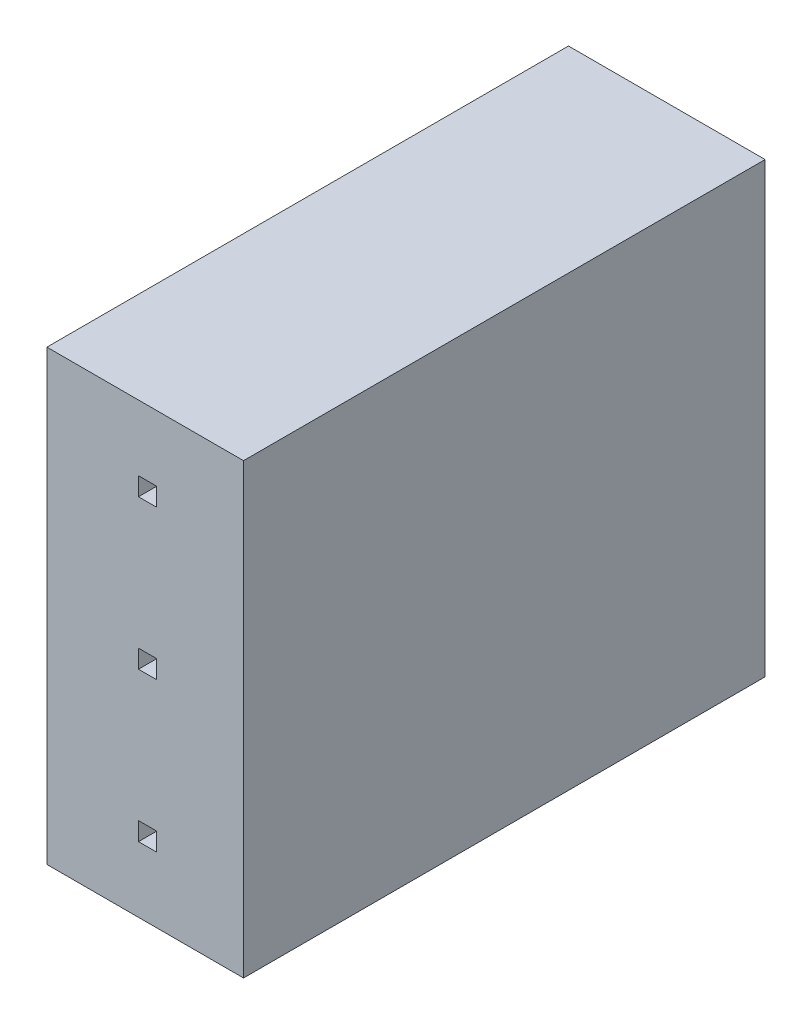
ISO-10303-21;
HEADER;
FILE_DESCRIPTION(('STEP AP214'),'2;1');
FILE_NAME('part.step','',(''),(''),'','','');
FILE_SCHEMA(('AUTOMOTIVE_DESIGN { 1 0 10303 214 1 1 1 1 }'));
ENDSEC;
DATA;
#1=APPLICATION_CONTEXT('core data for automotive mechanical design processes');
#2=APPLICATION_PROTOCOL_DEFINITION('international standard','automotive_design',2000,#1);
#3=PRODUCT_CONTEXT('',#1,'mechanical');
#4=PRODUCT('Part','Part','',(#3));
#5=PRODUCT_RELATED_PRODUCT_CATEGORY('part','',(#4));
#6=PRODUCT_DEFINITION_FORMATION('','',#4);
#7=PRODUCT_DEFINITION_CONTEXT('part definition',#1,'design');
#8=PRODUCT_DEFINITION('design','',#6,#7);
#9=PRODUCT_DEFINITION_SHAPE('','',#8);
#10=(LENGTH_UNIT() NAMED_UNIT(*) SI_UNIT(.MILLI.,.METRE.));
#11=(NAMED_UNIT(*) PLANE_ANGLE_UNIT() SI_UNIT($,.RADIAN.));
#12=(NAMED_UNIT(*) SI_UNIT($,.STERADIAN.) SOLID_ANGLE_UNIT());
#13=UNCERTAINTY_MEASURE_WITH_UNIT(LENGTH_MEASURE(1.E-05),#10,'distance_accuracy_value','');
#14=(GEOMETRIC_REPRESENTATION_CONTEXT(3) GLOBAL_UNCERTAINTY_ASSIGNED_CONTEXT((#13)) GLOBAL_UNIT_ASSIGNED_CONTEXT((#10,
#11,#12)) REPRESENTATION_CONTEXT('',''));
#15=CARTESIAN_POINT('',(0.,0.,0.));
#16=DIRECTION('',(0.,0.,1.));
#17=DIRECTION('',(1.,0.,0.));
#18=AXIS2_PLACEMENT_3D('',#15,#16,#17);
#19=CARTESIAN_POINT('',(0.,0.,10.));
#20=DIRECTION('',(0.,0.,1.));
#21=DIRECTION('',(1.,0.,0.));
#22=AXIS2_PLACEMENT_3D('',#19,#20,#21);
#23=PLANE('',#22);
#24=DIRECTION('',(-1.,0.,0.));
#25=VECTOR('',#24,1.);
#26=CARTESIAN_POINT('',(1.8390508777679,4.295,10.));
#27=LINE('',#26,#25);
#28=CARTESIAN_POINT('',(1.8390508777679,4.295,10.));
#29=VERTEX_POINT('',#28);
#30=CARTESIAN_POINT('',(-1.9309491222321,4.295,10.));
#31=VERTEX_POINT('',#30);
#32=EDGE_CURVE('E359',#29,#31,#27,.T.);
#33=ORIENTED_EDGE('',*,*,#32,.T.);
#34=DIRECTION('',(0.,-1.,0.));
#35=VECTOR('',#34,1.);
#36=CARTESIAN_POINT('',(-1.9309491222321,4.295,10.));
#37=LINE('',#36,#35);
#38=CARTESIAN_POINT('',(-1.9309491222321,-4.295,10.));
#39=VERTEX_POINT('',#38);
#40=EDGE_CURVE('E363',#31,#39,#37,.T.);
#41=ORIENTED_EDGE('',*,*,#40,.T.);
#42=DIRECTION('',(1.,0.,0.));
#43=VECTOR('',#42,1.);
#44=CARTESIAN_POINT('',(-1.9309491222321,-4.295,10.));
#45=LINE('',#44,#43);
#46=CARTESIAN_POINT('',(1.8390508777679,-4.295,10.));
#47=VERTEX_POINT('',#46);
#48=EDGE_CURVE('E367',#39,#47,#45,.T.);
#49=ORIENTED_EDGE('',*,*,#48,.T.);
#50=DIRECTION('',(0.,1.,0.));
#51=VECTOR('',#50,1.);
#52=CARTESIAN_POINT('',(1.8390508777679,-4.295,10.));
#53=LINE('',#52,#51);
#54=EDGE_CURVE('E370',#47,#29,#53,.T.);
#55=ORIENTED_EDGE('',*,*,#54,.T.);
#56=EDGE_LOOP('',(#33,#41,#49,#55));
#57=FACE_BOUND('',#56,.T.);
#58=DIRECTION('',(0.,1.,0.));
#59=VECTOR('',#58,1.);
#60=CARTESIAN_POINT('',(0.175,0.,10.));
#61=LINE('',#60,#59);
#62=CARTESIAN_POINT('',(0.175,2.6883,10.));
#63=VERTEX_POINT('',#62);
#64=CARTESIAN_POINT('',(0.175,3.0383,10.));
#65=VERTEX_POINT('',#64);
#66=EDGE_CURVE('E319',#63,#65,#61,.T.);
#67=ORIENTED_EDGE('',*,*,#66,.F.);
#68=DIRECTION('',(1.,0.,0.));
#69=VECTOR('',#68,1.);
#70=CARTESIAN_POINT('',(0.,2.6883,10.));
#71=LINE('',#70,#69);
#72=CARTESIAN_POINT('',(-0.175,2.6883,10.));
#73=VERTEX_POINT('',#72);
#74=EDGE_CURVE('E316',#73,#63,#71,.T.);
#75=ORIENTED_EDGE('',*,*,#74,.F.);
#76=DIRECTION('',(0.,-1.,0.));
#77=VECTOR('',#76,1.);
#78=CARTESIAN_POINT('',(-0.175,0.,10.));
#79=LINE('',#78,#77);
#80=CARTESIAN_POINT('',(-0.175,3.0383,10.));
#81=VERTEX_POINT('',#80);
#82=EDGE_CURVE('E327',#81,#73,#79,.T.);
#83=ORIENTED_EDGE('',*,*,#82,.F.);
#84=DIRECTION('',(-1.,0.,0.));
#85=VECTOR('',#84,1.);
#86=CARTESIAN_POINT('',(0.,3.0383,10.));
#87=LINE('',#86,#85);
#88=EDGE_CURVE('E323',#65,#81,#87,.T.);
#89=ORIENTED_EDGE('',*,*,#88,.F.);
#90=EDGE_LOOP('',(#67,#75,#83,#89));
#91=FACE_BOUND('',#90,.T.);
#92=DIRECTION('',(0.,-1.,0.));
#93=VECTOR('',#92,1.);
#94=CARTESIAN_POINT('',(-0.175,0.,10.));
#95=LINE('',#94,#93);
#96=CARTESIAN_POINT('',(-0.175,0.175,10.));
#97=VERTEX_POINT('',#96);
#98=CARTESIAN_POINT('',(-0.175,-0.175,10.));
#99=VERTEX_POINT('',#98);
#100=EDGE_CURVE('E276',#97,#99,#95,.T.);
#101=ORIENTED_EDGE('',*,*,#100,.F.);
#102=DIRECTION('',(-1.,0.,0.));
#103=VECTOR('',#102,1.);
#104=CARTESIAN_POINT('',(0.,0.175,10.));
#105=LINE('',#104,#103);
#106=CARTESIAN_POINT('',(0.175,0.175,10.));
#107=VERTEX_POINT('',#106);
#108=EDGE_CURVE('E273',#107,#97,#105,.T.);
#109=ORIENTED_EDGE('',*,*,#108,.F.);
#110=DIRECTION('',(0.,1.,0.));
#111=VECTOR('',#110,1.);
#112=CARTESIAN_POINT('',(0.175,0.,10.));
#113=LINE('',#112,#111);
#114=CARTESIAN_POINT('',(0.175,-0.175,10.));
#115=VERTEX_POINT('',#114);
#116=EDGE_CURVE('E284',#115,#107,#113,.T.);
#117=ORIENTED_EDGE('',*,*,#116,.F.);
#118=DIRECTION('',(1.,0.,0.));
#119=VECTOR('',#118,1.);
#120=CARTESIAN_POINT('',(0.,-0.175,10.));
#121=LINE('',#120,#119);
#122=EDGE_CURVE('E280',#99,#115,#121,.T.);
#123=ORIENTED_EDGE('',*,*,#122,.F.);
#124=EDGE_LOOP('',(#101,#109,#117,#123));
#125=FACE_BOUND('',#124,.T.);
#126=DIRECTION('',(0.,1.,0.));
#127=VECTOR('',#126,1.);
#128=CARTESIAN_POINT('',(0.175,-3.0383,10.));
#129=LINE('',#128,#127);
#130=CARTESIAN_POINT('',(0.175,-3.0383,10.));
#131=VERTEX_POINT('',#130);
#132=CARTESIAN_POINT('',(0.175,-2.6883,10.));
#133=VERTEX_POINT('',#132);
#134=EDGE_CURVE('E234',#131,#133,#129,.T.);
#135=ORIENTED_EDGE('',*,*,#134,.F.);
#136=DIRECTION('',(1.,0.,0.));
#137=VECTOR('',#136,1.);
#138=CARTESIAN_POINT('',(-0.175,-3.0383,10.));
#139=LINE('',#138,#137);
#140=CARTESIAN_POINT('',(-0.175,-3.0383,10.));
#141=VERTEX_POINT('',#140);
#142=EDGE_CURVE('E225',#141,#131,#139,.T.);
#143=ORIENTED_EDGE('',*,*,#142,.F.);
#144=DIRECTION('',(0.,-1.,0.));
#145=VECTOR('',#144,1.);
#146=CARTESIAN_POINT('',(-0.175,-2.6883,10.));
#147=LINE('',#146,#145);
#148=CARTESIAN_POINT('',(-0.175,-2.6883,10.));
#149=VERTEX_POINT('',#148);
#150=EDGE_CURVE('E251',#149,#141,#147,.T.);
#151=ORIENTED_EDGE('',*,*,#150,.F.);
#152=DIRECTION('',(-1.,0.,0.));
#153=VECTOR('',#152,1.);
#154=CARTESIAN_POINT('',(0.175,-2.6883,10.));
#155=LINE('',#154,#153);
#156=EDGE_CURVE('E247',#133,#149,#155,.T.);
#157=ORIENTED_EDGE('',*,*,#156,.F.);
#158=EDGE_LOOP('',(#135,#143,#151,#157));
#159=FACE_BOUND('',#158,.T.);
#160=ADVANCED_FACE('F111',(#57,#91,#125,#159),#23,.T.);
#161=CARTESIAN_POINT('',(0.,0.,0.));
#162=DIRECTION('',(0.,0.,1.));
#163=DIRECTION('',(1.,0.,0.));
#164=AXIS2_PLACEMENT_3D('',#161,#162,#163);
#165=PLANE('',#164);
#166=DIRECTION('',(-1.,0.,0.));
#167=VECTOR('',#166,1.);
#168=CARTESIAN_POINT('',(0.,0.175,0.));
#169=LINE('',#168,#167);
#170=CARTESIAN_POINT('',(0.175,0.175,0.));
#171=VERTEX_POINT('',#170);
#172=CARTESIAN_POINT('',(-0.175,0.175,0.));
#173=VERTEX_POINT('',#172);
#174=EDGE_CURVE('E243',#171,#173,#169,.T.);
#175=ORIENTED_EDGE('',*,*,#174,.T.);
#176=DIRECTION('',(0.,-1.,0.));
#177=VECTOR('',#176,1.);
#178=CARTESIAN_POINT('',(-0.175,0.,0.));
#179=LINE('',#178,#177);
#180=CARTESIAN_POINT('',(-0.175,-0.175,0.));
#181=VERTEX_POINT('',#180);
#182=EDGE_CURVE('E291',#173,#181,#179,.T.);
#183=ORIENTED_EDGE('',*,*,#182,.T.);
#184=DIRECTION('',(1.,0.,0.));
#185=VECTOR('',#184,1.);
#186=CARTESIAN_POINT('',(0.,-0.175,0.));
#187=LINE('',#186,#185);
#188=CARTESIAN_POINT('',(0.175,-0.175,0.));
#189=VERTEX_POINT('',#188);
#190=EDGE_CURVE('E295',#181,#189,#187,.T.);
#191=ORIENTED_EDGE('',*,*,#190,.T.);
#192=DIRECTION('',(0.,1.,0.));
#193=VECTOR('',#192,1.);
#194=CARTESIAN_POINT('',(0.175,0.,0.));
#195=LINE('',#194,#193);
#196=EDGE_CURVE('E277',#189,#171,#195,.T.);
#197=ORIENTED_EDGE('',*,*,#196,.T.);
#198=EDGE_LOOP('',(#175,#183,#191,#197));
#199=FACE_BOUND('',#198,.T.);
#200=DIRECTION('',(-1.,0.,0.));
#201=VECTOR('',#200,1.);
#202=CARTESIAN_POINT('',(1.8390508777679,4.295,0.));
#203=LINE('',#202,#201);
#204=CARTESIAN_POINT('',(1.8390508777679,4.295,0.));
#205=VERTEX_POINT('',#204);
#206=CARTESIAN_POINT('',(-1.9309491222321,4.295,0.));
#207=VERTEX_POINT('',#206);
#208=EDGE_CURVE('E358',#205,#207,#203,.T.);
#209=ORIENTED_EDGE('',*,*,#208,.F.);
#210=DIRECTION('',(0.,1.,0.));
#211=VECTOR('',#210,1.);
#212=CARTESIAN_POINT('',(1.8390508777679,-4.295,0.));
#213=LINE('',#212,#211);
#214=CARTESIAN_POINT('',(1.8390508777679,-4.295,0.));
#215=VERTEX_POINT('',#214);
#216=EDGE_CURVE('E364',#215,#205,#213,.T.);
#217=ORIENTED_EDGE('',*,*,#216,.F.);
#218=DIRECTION('',(1.,0.,0.));
#219=VECTOR('',#218,1.);
#220=CARTESIAN_POINT('',(-1.9309491222321,-4.295,0.));
#221=LINE('',#220,#219);
#222=CARTESIAN_POINT('',(-1.9309491222321,-4.295,0.));
#223=VERTEX_POINT('',#222);
#224=EDGE_CURVE('E380',#223,#215,#221,.T.);
#225=ORIENTED_EDGE('',*,*,#224,.F.);
#226=DIRECTION('',(0.,-1.,0.));
#227=VECTOR('',#226,1.);
#228=CARTESIAN_POINT('',(-1.9309491222321,4.295,0.));
#229=LINE('',#228,#227);
#230=EDGE_CURVE('E377',#207,#223,#229,.T.);
#231=ORIENTED_EDGE('',*,*,#230,.F.);
#232=EDGE_LOOP('',(#209,#217,#225,#231));
#233=FACE_BOUND('',#232,.T.);
#234=DIRECTION('',(1.,0.,0.));
#235=VECTOR('',#234,1.);
#236=CARTESIAN_POINT('',(0.,2.6883,0.));
#237=LINE('',#236,#235);
#238=CARTESIAN_POINT('',(-0.175,2.6883,0.));
#239=VERTEX_POINT('',#238);
#240=CARTESIAN_POINT('',(0.175,2.6883,0.));
#241=VERTEX_POINT('',#240);
#242=EDGE_CURVE('E315',#239,#241,#237,.T.);
#243=ORIENTED_EDGE('',*,*,#242,.T.);
#244=DIRECTION('',(0.,1.,0.));
#245=VECTOR('',#244,1.);
#246=CARTESIAN_POINT('',(0.175,0.,0.));
#247=LINE('',#246,#245);
#248=CARTESIAN_POINT('',(0.175,3.0383,0.));
#249=VERTEX_POINT('',#248);
#250=EDGE_CURVE('E334',#241,#249,#247,.T.);
#251=ORIENTED_EDGE('',*,*,#250,.T.);
#252=DIRECTION('',(-1.,0.,0.));
#253=VECTOR('',#252,1.);
#254=CARTESIAN_POINT('',(0.,3.0383,0.));
#255=LINE('',#254,#253);
#256=CARTESIAN_POINT('',(-0.175,3.0383,0.));
#257=VERTEX_POINT('',#256);
#258=EDGE_CURVE('E338',#249,#257,#255,.T.);
#259=ORIENTED_EDGE('',*,*,#258,.T.);
#260=DIRECTION('',(0.,-1.,0.));
#261=VECTOR('',#260,1.);
#262=CARTESIAN_POINT('',(-0.175,0.,0.));
#263=LINE('',#262,#261);
#264=EDGE_CURVE('E320',#257,#239,#263,.T.);
#265=ORIENTED_EDGE('',*,*,#264,.T.);
#266=EDGE_LOOP('',(#243,#251,#259,#265));
#267=FACE_BOUND('',#266,.T.);
#268=DIRECTION('',(1.,0.,0.));
#269=VECTOR('',#268,1.);
#270=CARTESIAN_POINT('',(-0.175,-3.0383,0.));
#271=LINE('',#270,#269);
#272=CARTESIAN_POINT('',(-0.175,-3.0383,0.));
#273=VERTEX_POINT('',#272);
#274=CARTESIAN_POINT('',(0.175,-3.0383,0.));
#275=VERTEX_POINT('',#274);
#276=EDGE_CURVE('E135',#273,#275,#271,.T.);
#277=ORIENTED_EDGE('',*,*,#276,.T.);
#278=DIRECTION('',(0.,1.,0.));
#279=VECTOR('',#278,1.);
#280=CARTESIAN_POINT('',(0.175,-3.0383,0.));
#281=LINE('',#280,#279);
#282=CARTESIAN_POINT('',(0.175,-2.6883,0.));
#283=VERTEX_POINT('',#282);
#284=EDGE_CURVE('E241',#275,#283,#281,.T.);
#285=ORIENTED_EDGE('',*,*,#284,.T.);
#286=DIRECTION('',(-1.,0.,0.));
#287=VECTOR('',#286,1.);
#288=CARTESIAN_POINT('',(0.175,-2.6883,0.));
#289=LINE('',#288,#287);
#290=CARTESIAN_POINT('',(-0.175,-2.6883,0.));
#291=VERTEX_POINT('',#290);
#292=EDGE_CURVE('E260',#283,#291,#289,.T.);
#293=ORIENTED_EDGE('',*,*,#292,.T.);
#294=DIRECTION('',(0.,-1.,0.));
#295=VECTOR('',#294,1.);
#296=CARTESIAN_POINT('',(-0.175,-2.6883,0.));
#297=LINE('',#296,#295);
#298=EDGE_CURVE('E235',#291,#273,#297,.T.);
#299=ORIENTED_EDGE('',*,*,#298,.T.);
#300=EDGE_LOOP('',(#277,#285,#293,#299));
#301=FACE_BOUND('',#300,.T.);
#302=ADVANCED_FACE('F403',(#199,#233,#267,#301),#165,.F.);
#303=CARTESIAN_POINT('',(1.8390508777679,4.295,10.));
#304=DIRECTION('',(0.,-1.,0.));
#305=DIRECTION('',(0.,0.,-1.));
#306=AXIS2_PLACEMENT_3D('',#303,#304,#305);
#307=PLANE('',#306);
#308=ORIENTED_EDGE('',*,*,#208,.T.);
#309=DIRECTION('',(0.,0.,-1.));
#310=VECTOR('',#309,1.);
#311=CARTESIAN_POINT('',(-1.9309491222321,4.295,10.));
#312=LINE('',#311,#310);
#313=EDGE_CURVE('E12',#31,#207,#312,.T.);
#314=ORIENTED_EDGE('',*,*,#313,.F.);
#315=ORIENTED_EDGE('',*,*,#32,.F.);
#316=DIRECTION('',(0.,0.,-1.));
#317=VECTOR('',#316,1.);
#318=CARTESIAN_POINT('',(1.8390508777679,4.295,10.));
#319=LINE('',#318,#317);
#320=EDGE_CURVE('E373',#29,#205,#319,.T.);
#321=ORIENTED_EDGE('',*,*,#320,.T.);
#322=EDGE_LOOP('',(#308,#314,#315,#321));
#323=FACE_BOUND('',#322,.T.);
#324=ADVANCED_FACE('F113',(#323),#307,.F.);
#325=CARTESIAN_POINT('',(-1.9309491222321,4.295,10.));
#326=DIRECTION('',(1.,0.,0.));
#327=DIRECTION('',(0.,0.,-1.));
#328=AXIS2_PLACEMENT_3D('',#325,#326,#327);
#329=PLANE('',#328);
#330=ORIENTED_EDGE('',*,*,#230,.T.);
#331=DIRECTION('',(0.,0.,-1.));
#332=VECTOR('',#331,1.);
#333=CARTESIAN_POINT('',(-1.9309491222321,-4.295,10.));
#334=LINE('',#333,#332);
#335=EDGE_CURVE('E120',#39,#223,#334,.T.);
#336=ORIENTED_EDGE('',*,*,#335,.F.);
#337=ORIENTED_EDGE('',*,*,#40,.F.);
#338=ORIENTED_EDGE('',*,*,#313,.T.);
#339=EDGE_LOOP('',(#330,#336,#337,#338));
#340=FACE_BOUND('',#339,.T.);
#341=ADVANCED_FACE('F414',(#340),#329,.F.);
#342=CARTESIAN_POINT('',(-1.9309491222321,-4.295,10.));
#343=DIRECTION('',(0.,1.,0.));
#344=DIRECTION('',(0.,0.,1.));
#345=AXIS2_PLACEMENT_3D('',#342,#343,#344);
#346=PLANE('',#345);
#347=ORIENTED_EDGE('',*,*,#224,.T.);
#348=DIRECTION('',(0.,0.,-1.));
#349=VECTOR('',#348,1.);
#350=CARTESIAN_POINT('',(1.8390508777679,-4.295,10.));
#351=LINE('',#350,#349);
#352=EDGE_CURVE('E388',#47,#215,#351,.T.);
#353=ORIENTED_EDGE('',*,*,#352,.F.);
#354=ORIENTED_EDGE('',*,*,#48,.F.);
#355=ORIENTED_EDGE('',*,*,#335,.T.);
#356=EDGE_LOOP('',(#347,#353,#354,#355));
#357=FACE_BOUND('',#356,.T.);
#358=ADVANCED_FACE('F397',(#357),#346,.F.);
#359=CARTESIAN_POINT('',(1.8390508777679,-4.295,10.));
#360=DIRECTION('',(-1.,0.,0.));
#361=DIRECTION('',(0.,0.,1.));
#362=AXIS2_PLACEMENT_3D('',#359,#360,#361);
#363=PLANE('',#362);
#364=ORIENTED_EDGE('',*,*,#216,.T.);
#365=ORIENTED_EDGE('',*,*,#320,.F.);
#366=ORIENTED_EDGE('',*,*,#54,.F.);
#367=ORIENTED_EDGE('',*,*,#352,.T.);
#368=EDGE_LOOP('',(#364,#365,#366,#367));
#369=FACE_BOUND('',#368,.T.);
#370=ADVANCED_FACE('F407',(#369),#363,.F.);
#371=CARTESIAN_POINT('',(0.,2.6883,10.));
#372=DIRECTION('',(0.,1.,0.));
#373=DIRECTION('',(0.,0.,1.));
#374=AXIS2_PLACEMENT_3D('',#371,#372,#373);
#375=PLANE('',#374);
#376=ORIENTED_EDGE('',*,*,#242,.F.);
#377=DIRECTION('',(0.,0.,-1.));
#378=VECTOR('',#377,1.);
#379=CARTESIAN_POINT('',(-0.175,2.6883,10.));
#380=LINE('',#379,#378);
#381=EDGE_CURVE('E330',#73,#239,#380,.T.);
#382=ORIENTED_EDGE('',*,*,#381,.F.);
#383=ORIENTED_EDGE('',*,*,#74,.T.);
#384=DIRECTION('',(0.,0.,-1.));
#385=VECTOR('',#384,1.);
#386=CARTESIAN_POINT('',(0.175,2.6883,10.));
#387=LINE('',#386,#385);
#388=EDGE_CURVE('E354',#63,#241,#387,.T.);
#389=ORIENTED_EDGE('',*,*,#388,.T.);
#390=EDGE_LOOP('',(#376,#382,#383,#389));
#391=FACE_BOUND('',#390,.T.);
#392=ADVANCED_FACE('F429',(#391),#375,.T.);
#393=CARTESIAN_POINT('',(0.175,0.,10.));
#394=DIRECTION('',(-1.,0.,0.));
#395=DIRECTION('',(0.,0.,1.));
#396=AXIS2_PLACEMENT_3D('',#393,#394,#395);
#397=PLANE('',#396);
#398=ORIENTED_EDGE('',*,*,#250,.F.);
#399=ORIENTED_EDGE('',*,*,#388,.F.);
#400=ORIENTED_EDGE('',*,*,#66,.T.);
#401=DIRECTION('',(0.,0.,-1.));
#402=VECTOR('',#401,1.);
#403=CARTESIAN_POINT('',(0.175,3.0383,10.));
#404=LINE('',#403,#402);
#405=EDGE_CURVE('E351',#65,#249,#404,.T.);
#406=ORIENTED_EDGE('',*,*,#405,.T.);
#407=EDGE_LOOP('',(#398,#399,#400,#406));
#408=FACE_BOUND('',#407,.T.);
#409=ADVANCED_FACE('F436',(#408),#397,.T.);
#410=CARTESIAN_POINT('',(0.,3.0383,10.));
#411=DIRECTION('',(0.,-1.,0.));
#412=DIRECTION('',(0.,0.,-1.));
#413=AXIS2_PLACEMENT_3D('',#410,#411,#412);
#414=PLANE('',#413);
#415=ORIENTED_EDGE('',*,*,#258,.F.);
#416=ORIENTED_EDGE('',*,*,#405,.F.);
#417=ORIENTED_EDGE('',*,*,#88,.T.);
#418=DIRECTION('',(0.,0.,-1.));
#419=VECTOR('',#418,1.);
#420=CARTESIAN_POINT('',(-0.175,3.0383,10.));
#421=LINE('',#420,#419);
#422=EDGE_CURVE('E348',#81,#257,#421,.T.);
#423=ORIENTED_EDGE('',*,*,#422,.T.);
#424=EDGE_LOOP('',(#415,#416,#417,#423));
#425=FACE_BOUND('',#424,.T.);
#426=ADVANCED_FACE('F441',(#425),#414,.T.);
#427=CARTESIAN_POINT('',(-0.175,0.,10.));
#428=DIRECTION('',(1.,0.,0.));
#429=DIRECTION('',(0.,0.,-1.));
#430=AXIS2_PLACEMENT_3D('',#427,#428,#429);
#431=PLANE('',#430);
#432=ORIENTED_EDGE('',*,*,#264,.F.);
#433=ORIENTED_EDGE('',*,*,#422,.F.);
#434=ORIENTED_EDGE('',*,*,#82,.T.);
#435=ORIENTED_EDGE('',*,*,#381,.T.);
#436=EDGE_LOOP('',(#432,#433,#434,#435));
#437=FACE_BOUND('',#436,.T.);
#438=ADVANCED_FACE('F448',(#437),#431,.T.);
#439=CARTESIAN_POINT('',(0.,0.175,10.));
#440=DIRECTION('',(0.,-1.,0.));
#441=DIRECTION('',(0.,0.,-1.));
#442=AXIS2_PLACEMENT_3D('',#439,#440,#441);
#443=PLANE('',#442);
#444=ORIENTED_EDGE('',*,*,#174,.F.);
#445=DIRECTION('',(0.,0.,-1.));
#446=VECTOR('',#445,1.);
#447=CARTESIAN_POINT('',(0.175,0.175,10.));
#448=LINE('',#447,#446);
#449=EDGE_CURVE('E287',#107,#171,#448,.T.);
#450=ORIENTED_EDGE('',*,*,#449,.F.);
#451=ORIENTED_EDGE('',*,*,#108,.T.);
#452=DIRECTION('',(0.,0.,-1.));
#453=VECTOR('',#452,1.);
#454=CARTESIAN_POINT('',(-0.175,0.175,10.));
#455=LINE('',#454,#453);
#456=EDGE_CURVE('E311',#97,#173,#455,.T.);
#457=ORIENTED_EDGE('',*,*,#456,.T.);
#458=EDGE_LOOP('',(#444,#450,#451,#457));
#459=FACE_BOUND('',#458,.T.);
#460=ADVANCED_FACE('F470',(#459),#443,.T.);
#461=CARTESIAN_POINT('',(-0.175,0.,10.));
#462=DIRECTION('',(1.,0.,0.));
#463=DIRECTION('',(0.,0.,-1.));
#464=AXIS2_PLACEMENT_3D('',#461,#462,#463);
#465=PLANE('',#464);
#466=ORIENTED_EDGE('',*,*,#182,.F.);
#467=ORIENTED_EDGE('',*,*,#456,.F.);
#468=ORIENTED_EDGE('',*,*,#100,.T.);
#469=DIRECTION('',(0.,0.,-1.));
#470=VECTOR('',#469,1.);
#471=CARTESIAN_POINT('',(-0.175,-0.175,10.));
#472=LINE('',#471,#470);
#473=EDGE_CURVE('E308',#99,#181,#472,.T.);
#474=ORIENTED_EDGE('',*,*,#473,.T.);
#475=EDGE_LOOP('',(#466,#467,#468,#474));
#476=FACE_BOUND('',#475,.T.);
#477=ADVANCED_FACE('F464',(#476),#465,.T.);
#478=CARTESIAN_POINT('',(0.,-0.175,10.));
#479=DIRECTION('',(0.,1.,0.));
#480=DIRECTION('',(0.,0.,1.));
#481=AXIS2_PLACEMENT_3D('',#478,#479,#480);
#482=PLANE('',#481);
#483=ORIENTED_EDGE('',*,*,#190,.F.);
#484=ORIENTED_EDGE('',*,*,#473,.F.);
#485=ORIENTED_EDGE('',*,*,#122,.T.);
#486=DIRECTION('',(0.,0.,-1.));
#487=VECTOR('',#486,1.);
#488=CARTESIAN_POINT('',(0.175,-0.175,10.));
#489=LINE('',#488,#487);
#490=EDGE_CURVE('E305',#115,#189,#489,.T.);
#491=ORIENTED_EDGE('',*,*,#490,.T.);
#492=EDGE_LOOP('',(#483,#484,#485,#491));
#493=FACE_BOUND('',#492,.T.);
#494=ADVANCED_FACE('F467',(#493),#482,.T.);
#495=CARTESIAN_POINT('',(0.175,0.,10.));
#496=DIRECTION('',(-1.,0.,0.));
#497=DIRECTION('',(0.,0.,1.));
#498=AXIS2_PLACEMENT_3D('',#495,#496,#497);
#499=PLANE('',#498);
#500=ORIENTED_EDGE('',*,*,#196,.F.);
#501=ORIENTED_EDGE('',*,*,#490,.F.);
#502=ORIENTED_EDGE('',*,*,#116,.T.);
#503=ORIENTED_EDGE('',*,*,#449,.T.);
#504=EDGE_LOOP('',(#500,#501,#502,#503));
#505=FACE_BOUND('',#504,.T.);
#506=ADVANCED_FACE('F473',(#505),#499,.T.);
#507=CARTESIAN_POINT('',(-0.175,-3.0383,10.));
#508=DIRECTION('',(0.,1.,0.));
#509=DIRECTION('',(0.,0.,1.));
#510=AXIS2_PLACEMENT_3D('',#507,#508,#509);
#511=PLANE('',#510);
#512=ORIENTED_EDGE('',*,*,#276,.F.);
#513=DIRECTION('',(0.,0.,-1.));
#514=VECTOR('',#513,1.);
#515=CARTESIAN_POINT('',(-0.175,-3.0383,10.));
#516=LINE('',#515,#514);
#517=EDGE_CURVE('E229',#141,#273,#516,.T.);
#518=ORIENTED_EDGE('',*,*,#517,.F.);
#519=ORIENTED_EDGE('',*,*,#142,.T.);
#520=DIRECTION('',(0.,0.,-1.));
#521=VECTOR('',#520,1.);
#522=CARTESIAN_POINT('',(0.175,-3.0383,10.));
#523=LINE('',#522,#521);
#524=EDGE_CURVE('E228',#131,#275,#523,.T.);
#525=ORIENTED_EDGE('',*,*,#524,.T.);
#526=EDGE_LOOP('',(#512,#518,#519,#525));
#527=FACE_BOUND('',#526,.T.);
#528=ADVANCED_FACE('F227',(#527),#511,.T.);
#529=CARTESIAN_POINT('',(0.175,-3.0383,10.));
#530=DIRECTION('',(-1.,0.,0.));
#531=DIRECTION('',(0.,0.,1.));
#532=AXIS2_PLACEMENT_3D('',#529,#530,#531);
#533=PLANE('',#532);
#534=ORIENTED_EDGE('',*,*,#284,.F.);
#535=ORIENTED_EDGE('',*,*,#524,.F.);
#536=ORIENTED_EDGE('',*,*,#134,.T.);
#537=DIRECTION('',(0.,0.,-1.));
#538=VECTOR('',#537,1.);
#539=CARTESIAN_POINT('',(0.175,-2.6883,10.));
#540=LINE('',#539,#538);
#541=EDGE_CURVE('E244',#133,#283,#540,.T.);
#542=ORIENTED_EDGE('',*,*,#541,.T.);
#543=EDGE_LOOP('',(#534,#535,#536,#542));
#544=FACE_BOUND('',#543,.T.);
#545=ADVANCED_FACE('F238',(#544),#533,.T.);
#546=CARTESIAN_POINT('',(0.175,-2.6883,10.));
#547=DIRECTION('',(0.,-1.,0.));
#548=DIRECTION('',(0.,0.,-1.));
#549=AXIS2_PLACEMENT_3D('',#546,#547,#548);
#550=PLANE('',#549);
#551=ORIENTED_EDGE('',*,*,#292,.F.);
#552=ORIENTED_EDGE('',*,*,#541,.F.);
#553=ORIENTED_EDGE('',*,*,#156,.T.);
#554=DIRECTION('',(0.,0.,-1.));
#555=VECTOR('',#554,1.);
#556=CARTESIAN_POINT('',(-0.175,-2.6883,10.));
#557=LINE('',#556,#555);
#558=EDGE_CURVE('E127',#149,#291,#557,.T.);
#559=ORIENTED_EDGE('',*,*,#558,.T.);
#560=EDGE_LOOP('',(#551,#552,#553,#559));
#561=FACE_BOUND('',#560,.T.);
#562=ADVANCED_FACE('F530',(#561),#550,.T.);
#563=CARTESIAN_POINT('',(-0.175,-2.6883,10.));
#564=DIRECTION('',(1.,0.,0.));
#565=DIRECTION('',(0.,0.,-1.));
#566=AXIS2_PLACEMENT_3D('',#563,#564,#565);
#567=PLANE('',#566);
#568=ORIENTED_EDGE('',*,*,#298,.F.);
#569=ORIENTED_EDGE('',*,*,#558,.F.);
#570=ORIENTED_EDGE('',*,*,#150,.T.);
#571=ORIENTED_EDGE('',*,*,#517,.T.);
#572=EDGE_LOOP('',(#568,#569,#570,#571));
#573=FACE_BOUND('',#572,.T.);
#574=ADVANCED_FACE('F538',(#573),#567,.T.);
#575=CLOSED_SHELL('',(#160,#302,#324,#341,#358,#370,#392,#409,#426,#438,#460,#477,#494,#506,
#528,#545,#562,#574));
#576=MANIFOLD_SOLID_BREP('B2',#575);
#577=ADVANCED_BREP_SHAPE_REPRESENTATION('',(#18,#576),#14);
#578=SHAPE_DEFINITION_REPRESENTATION(#9,#577);
ENDSEC;
END-ISO-10303-21;
